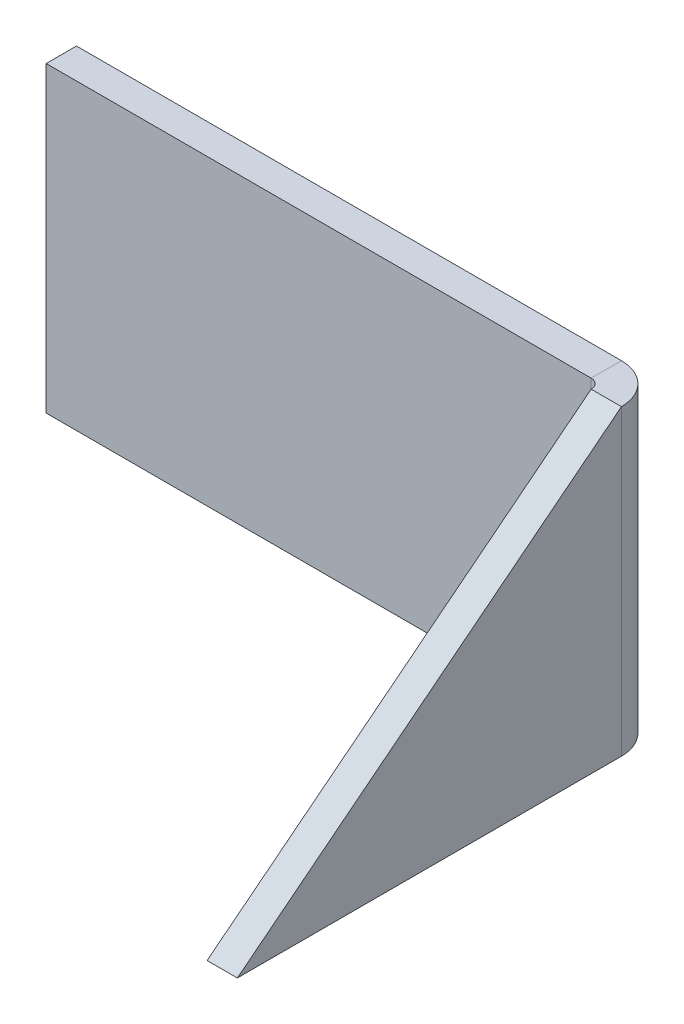
ISO-10303-21;
HEADER;
FILE_DESCRIPTION(('STEP AP214'),'2;1');
FILE_NAME('part.step','',(''),(''),'','','');
FILE_SCHEMA(('AUTOMOTIVE_DESIGN { 1 0 10303 214 1 1 1 1 }'));
ENDSEC;
DATA;
#1=APPLICATION_CONTEXT('core data for automotive mechanical design processes');
#2=APPLICATION_PROTOCOL_DEFINITION('international standard','automotive_design',2000,#1);
#3=PRODUCT_CONTEXT('',#1,'mechanical');
#4=PRODUCT('Part','Part','',(#3));
#5=PRODUCT_RELATED_PRODUCT_CATEGORY('part','',(#4));
#6=PRODUCT_DEFINITION_FORMATION('','',#4);
#7=PRODUCT_DEFINITION_CONTEXT('part definition',#1,'design');
#8=PRODUCT_DEFINITION('design','',#6,#7);
#9=PRODUCT_DEFINITION_SHAPE('','',#8);
#10=(LENGTH_UNIT() NAMED_UNIT(*) SI_UNIT(.MILLI.,.METRE.));
#11=(NAMED_UNIT(*) PLANE_ANGLE_UNIT() SI_UNIT($,.RADIAN.));
#12=(NAMED_UNIT(*) SI_UNIT($,.STERADIAN.) SOLID_ANGLE_UNIT());
#13=UNCERTAINTY_MEASURE_WITH_UNIT(LENGTH_MEASURE(1.E-05),#10,'distance_accuracy_value','');
#14=(GEOMETRIC_REPRESENTATION_CONTEXT(3) GLOBAL_UNCERTAINTY_ASSIGNED_CONTEXT((#13)) GLOBAL_UNIT_ASSIGNED_CONTEXT((#10,
#11,#12)) REPRESENTATION_CONTEXT('',''));
#15=CARTESIAN_POINT('',(0.,0.,0.));
#16=DIRECTION('',(0.,0.,1.));
#17=DIRECTION('',(1.,0.,0.));
#18=AXIS2_PLACEMENT_3D('',#15,#16,#17);
#19=CARTESIAN_POINT('',(-28.575,15.875,3.175));
#20=DIRECTION('',(0.,-1.,0.));
#21=DIRECTION('',(0.,0.,-1.));
#22=AXIS2_PLACEMENT_3D('',#19,#20,#21);
#23=PLANE('',#22);
#24=DIRECTION('',(-1.,0.,0.));
#25=VECTOR('',#24,1.);
#26=CARTESIAN_POINT('',(-28.575,15.875,0.));
#27=LINE('',#26,#25);
#28=CARTESIAN_POINT('',(28.575,15.875,0.));
#29=VERTEX_POINT('',#28);
#30=CARTESIAN_POINT('',(-28.575,15.875,0.));
#31=VERTEX_POINT('',#30);
#32=EDGE_CURVE('E175',#29,#31,#27,.T.);
#33=ORIENTED_EDGE('',*,*,#32,.T.);
#34=DIRECTION('',(0.,0.,-1.));
#35=VECTOR('',#34,1.);
#36=CARTESIAN_POINT('',(-28.575,15.875,3.175));
#37=LINE('',#36,#35);
#38=CARTESIAN_POINT('',(-28.575,15.875,3.175));
#39=VERTEX_POINT('',#38);
#40=EDGE_CURVE('E64',#39,#31,#37,.T.);
#41=ORIENTED_EDGE('',*,*,#40,.F.);
#42=DIRECTION('',(-1.,0.,0.));
#43=VECTOR('',#42,1.);
#44=CARTESIAN_POINT('',(-28.575,15.875,3.175));
#45=LINE('',#44,#43);
#46=CARTESIAN_POINT('',(28.575,15.875,3.175));
#47=VERTEX_POINT('',#46);
#48=EDGE_CURVE('E100',#47,#39,#45,.T.);
#49=ORIENTED_EDGE('',*,*,#48,.F.);
#50=DIRECTION('',(0.,0.,-1.));
#51=VECTOR('',#50,1.);
#52=CARTESIAN_POINT('',(28.575,15.875,3.175));
#53=LINE('',#52,#51);
#54=EDGE_CURVE('E13',#47,#29,#53,.T.);
#55=ORIENTED_EDGE('',*,*,#54,.T.);
#56=EDGE_LOOP('',(#33,#41,#49,#55));
#57=FACE_BOUND('',#56,.T.);
#58=ADVANCED_FACE('F56',(#57),#23,.F.);
#59=CARTESIAN_POINT('',(-28.575,15.875,3.175));
#60=DIRECTION('',(1.,0.,0.));
#61=DIRECTION('',(0.,1.,0.));
#62=AXIS2_PLACEMENT_3D('',#59,#60,#61);
#63=PLANE('',#62);
#64=DIRECTION('',(0.,-1.,0.));
#65=VECTOR('',#64,1.);
#66=CARTESIAN_POINT('',(-28.575,15.875,0.));
#67=LINE('',#66,#65);
#68=CARTESIAN_POINT('',(-28.575,-15.875,0.));
#69=VERTEX_POINT('',#68);
#70=EDGE_CURVE('E87',#31,#69,#67,.T.);
#71=ORIENTED_EDGE('',*,*,#70,.T.);
#72=DIRECTION('',(0.,0.,-1.));
#73=VECTOR('',#72,1.);
#74=CARTESIAN_POINT('',(-28.575,-15.875,3.175));
#75=LINE('',#74,#73);
#76=CARTESIAN_POINT('',(-28.575,-15.875,3.175));
#77=VERTEX_POINT('',#76);
#78=EDGE_CURVE('E182',#77,#69,#75,.T.);
#79=ORIENTED_EDGE('',*,*,#78,.F.);
#80=DIRECTION('',(0.,-1.,0.));
#81=VECTOR('',#80,1.);
#82=CARTESIAN_POINT('',(-28.575,15.875,3.175));
#83=LINE('',#82,#81);
#84=EDGE_CURVE('E168',#39,#77,#83,.T.);
#85=ORIENTED_EDGE('',*,*,#84,.F.);
#86=ORIENTED_EDGE('',*,*,#40,.T.);
#87=EDGE_LOOP('',(#71,#79,#85,#86));
#88=FACE_BOUND('',#87,.T.);
#89=ADVANCED_FACE('F184',(#88),#63,.F.);
#90=CARTESIAN_POINT('',(-28.575,-15.875,3.175));
#91=DIRECTION('',(0.,1.,0.));
#92=DIRECTION('',(0.,0.,1.));
#93=AXIS2_PLACEMENT_3D('',#90,#91,#92);
#94=PLANE('',#93);
#95=DIRECTION('',(1.,0.,0.));
#96=VECTOR('',#95,1.);
#97=CARTESIAN_POINT('',(-28.575,-15.875,0.));
#98=LINE('',#97,#96);
#99=CARTESIAN_POINT('',(28.575,-15.875,0.));
#100=VERTEX_POINT('',#99);
#101=EDGE_CURVE('E93',#69,#100,#98,.T.);
#102=ORIENTED_EDGE('',*,*,#101,.T.);
#103=DIRECTION('',(0.,0.,-1.));
#104=VECTOR('',#103,1.);
#105=CARTESIAN_POINT('',(28.575,-15.875,3.175));
#106=LINE('',#105,#104);
#107=CARTESIAN_POINT('',(28.575,-15.875,3.175));
#108=VERTEX_POINT('',#107);
#109=EDGE_CURVE('E171',#108,#100,#106,.T.);
#110=ORIENTED_EDGE('',*,*,#109,.F.);
#111=DIRECTION('',(1.,0.,0.));
#112=VECTOR('',#111,1.);
#113=CARTESIAN_POINT('',(-28.575,-15.875,3.175));
#114=LINE('',#113,#112);
#115=EDGE_CURVE('E72',#77,#108,#114,.T.);
#116=ORIENTED_EDGE('',*,*,#115,.F.);
#117=ORIENTED_EDGE('',*,*,#78,.T.);
#118=EDGE_LOOP('',(#102,#110,#116,#117));
#119=FACE_BOUND('',#118,.T.);
#120=ADVANCED_FACE('F221',(#119),#94,.F.);
#121=CARTESIAN_POINT('',(0.,0.,3.175));
#122=DIRECTION('',(0.,0.,1.));
#123=DIRECTION('',(1.,0.,0.));
#124=AXIS2_PLACEMENT_3D('',#121,#122,#123);
#125=PLANE('',#124);
#126=DIRECTION('',(0.,1.,0.));
#127=VECTOR('',#126,1.);
#128=CARTESIAN_POINT('',(28.575,15.875,3.175));
#129=LINE('',#128,#127);
#130=EDGE_CURVE('E165',#108,#47,#129,.T.);
#131=ORIENTED_EDGE('',*,*,#130,.T.);
#132=ORIENTED_EDGE('',*,*,#48,.T.);
#133=ORIENTED_EDGE('',*,*,#84,.T.);
#134=ORIENTED_EDGE('',*,*,#115,.T.);
#135=EDGE_LOOP('',(#131,#132,#133,#134));
#136=FACE_BOUND('',#135,.T.);
#137=ADVANCED_FACE('F225',(#136),#125,.T.);
#138=CARTESIAN_POINT('',(0.,0.,0.));
#139=DIRECTION('',(0.,0.,1.));
#140=DIRECTION('',(1.,0.,0.));
#141=AXIS2_PLACEMENT_3D('',#138,#139,#140);
#142=PLANE('',#141);
#143=DIRECTION('',(0.,1.,0.));
#144=VECTOR('',#143,1.);
#145=CARTESIAN_POINT('',(28.575,15.875,0.));
#146=LINE('',#145,#144);
#147=EDGE_CURVE('E172',#100,#29,#146,.T.);
#148=ORIENTED_EDGE('',*,*,#147,.F.);
#149=ORIENTED_EDGE('',*,*,#101,.F.);
#150=ORIENTED_EDGE('',*,*,#70,.F.);
#151=ORIENTED_EDGE('',*,*,#32,.F.);
#152=EDGE_LOOP('',(#148,#149,#150,#151));
#153=FACE_BOUND('',#152,.T.);
#154=ADVANCED_FACE('F187',(#153),#142,.F.);
#155=CARTESIAN_POINT('',(28.575,-15.875,4.175));
#156=DIRECTION('',(0.,-1.,0.));
#157=DIRECTION('',(0.,0.,-1.));
#158=AXIS2_PLACEMENT_3D('',#155,#156,#157);
#159=PLANE('',#158);
#160=DIRECTION('',(-1.,0.,0.));
#161=VECTOR('',#160,1.);
#162=CARTESIAN_POINT('',(32.75,-15.875,4.17499999999998));
#163=LINE('',#162,#161);
#164=CARTESIAN_POINT('',(29.575,-15.875,4.17499999999999));
#165=VERTEX_POINT('',#164);
#166=CARTESIAN_POINT('',(32.75,-15.875,4.17499999999998));
#167=VERTEX_POINT('',#166);
#168=EDGE_CURVE('E144',#165,#167,#163,.F.);
#169=ORIENTED_EDGE('',*,*,#168,.F.);
#170=CARTESIAN_POINT('',(28.575,-15.875,4.175));
#171=DIRECTION('',(0.,1.,0.));
#172=DIRECTION('',(0.,0.,1.));
#173=AXIS2_PLACEMENT_3D('',#170,#171,#172);
#174=CIRCLE('',#173,1.);
#175=EDGE_CURVE('E153',#108,#165,#174,.F.);
#176=ORIENTED_EDGE('',*,*,#175,.F.);
#177=ORIENTED_EDGE('',*,*,#109,.T.);
#178=CARTESIAN_POINT('',(28.575,-15.875,4.175));
#179=DIRECTION('',(0.,1.,0.));
#180=DIRECTION('',(0.,0.,1.));
#181=AXIS2_PLACEMENT_3D('',#178,#179,#180);
#182=CIRCLE('',#181,4.175);
#183=EDGE_CURVE('E176',#100,#167,#182,.F.);
#184=ORIENTED_EDGE('',*,*,#183,.T.);
#185=EDGE_LOOP('',(#169,#176,#177,#184));
#186=FACE_BOUND('',#185,.T.);
#187=ADVANCED_FACE('F192',(#186),#159,.T.);
#188=CARTESIAN_POINT('',(28.575,15.875,4.175));
#189=DIRECTION('',(0.,-1.,0.));
#190=DIRECTION('',(0.,0.,-1.));
#191=AXIS2_PLACEMENT_3D('',#188,#189,#190);
#192=PLANE('',#191);
#193=CARTESIAN_POINT('',(28.575,15.875,4.175));
#194=DIRECTION('',(0.,1.,0.));
#195=DIRECTION('',(0.,0.,1.));
#196=AXIS2_PLACEMENT_3D('',#193,#194,#195);
#197=CIRCLE('',#196,1.);
#198=CARTESIAN_POINT('',(29.575,15.875,4.17499999999999));
#199=VERTEX_POINT('',#198);
#200=EDGE_CURVE('E151',#199,#47,#197,.T.);
#201=ORIENTED_EDGE('',*,*,#200,.F.);
#202=DIRECTION('',(-1.,0.,0.));
#203=VECTOR('',#202,1.);
#204=CARTESIAN_POINT('',(29.575,15.875,4.17499999999999));
#205=LINE('',#204,#203);
#206=CARTESIAN_POINT('',(32.75,15.875,4.17499999999998));
#207=VERTEX_POINT('',#206);
#208=EDGE_CURVE('E122',#199,#207,#205,.F.);
#209=ORIENTED_EDGE('',*,*,#208,.T.);
#210=CARTESIAN_POINT('',(28.575,15.875,4.175));
#211=DIRECTION('',(0.,1.,0.));
#212=DIRECTION('',(0.,0.,1.));
#213=AXIS2_PLACEMENT_3D('',#210,#211,#212);
#214=CIRCLE('',#213,4.175);
#215=EDGE_CURVE('E159',#207,#29,#214,.T.);
#216=ORIENTED_EDGE('',*,*,#215,.T.);
#217=ORIENTED_EDGE('',*,*,#54,.F.);
#218=EDGE_LOOP('',(#201,#209,#216,#217));
#219=FACE_BOUND('',#218,.T.);
#220=ADVANCED_FACE('F156',(#219),#192,.F.);
#221=CARTESIAN_POINT('',(28.575,15.875,4.175));
#222=DIRECTION('',(0.,1.,0.));
#223=DIRECTION('',(1.,0.,0.));
#224=AXIS2_PLACEMENT_3D('',#221,#222,#223);
#225=CYLINDRICAL_SURFACE('',#224,4.175);
#226=ORIENTED_EDGE('',*,*,#147,.T.);
#227=ORIENTED_EDGE('',*,*,#215,.F.);
#228=DIRECTION('',(0.,1.,0.));
#229=VECTOR('',#228,1.);
#230=CARTESIAN_POINT('',(32.75,-15.875,4.17499999999998));
#231=LINE('',#230,#229);
#232=EDGE_CURVE('E134',#207,#167,#231,.F.);
#233=ORIENTED_EDGE('',*,*,#232,.T.);
#234=ORIENTED_EDGE('',*,*,#183,.F.);
#235=EDGE_LOOP('',(#226,#227,#233,#234));
#236=FACE_BOUND('',#235,.T.);
#237=ADVANCED_FACE('F194',(#236),#225,.T.);
#238=CARTESIAN_POINT('',(28.575,15.875,4.175));
#239=DIRECTION('',(0.,1.,0.));
#240=DIRECTION('',(1.,0.,0.));
#241=AXIS2_PLACEMENT_3D('',#238,#239,#240);
#242=CYLINDRICAL_SURFACE('',#241,1.);
#243=ORIENTED_EDGE('',*,*,#130,.F.);
#244=ORIENTED_EDGE('',*,*,#175,.T.);
#245=DIRECTION('',(0.,1.,0.));
#246=VECTOR('',#245,1.);
#247=CARTESIAN_POINT('',(29.575,-15.875,4.17499999999999));
#248=LINE('',#247,#246);
#249=EDGE_CURVE('E135',#165,#199,#248,.T.);
#250=ORIENTED_EDGE('',*,*,#249,.T.);
#251=ORIENTED_EDGE('',*,*,#200,.T.);
#252=EDGE_LOOP('',(#243,#244,#250,#251));
#253=FACE_BOUND('',#252,.T.);
#254=ADVANCED_FACE('F150',(#253),#242,.F.);
#255=CARTESIAN_POINT('',(32.75,-15.875,3.17499999999999));
#256=DIRECTION('',(0.,1.,0.));
#257=DIRECTION('',(0.,0.,1.));
#258=AXIS2_PLACEMENT_3D('',#255,#256,#257);
#259=PLANE('',#258);
#260=ORIENTED_EDGE('',*,*,#168,.T.);
#261=DIRECTION('',(0.,0.,-1.));
#262=VECTOR('',#261,1.);
#263=CARTESIAN_POINT('',(32.75,-15.875,-1.07963087370762E-13));
#264=LINE('',#263,#262);
#265=CARTESIAN_POINT('',(32.7500000000001,-15.875,44.45));
#266=VERTEX_POINT('',#265);
#267=EDGE_CURVE('E161',#266,#167,#264,.T.);
#268=ORIENTED_EDGE('',*,*,#267,.F.);
#269=DIRECTION('',(-1.,0.,0.));
#270=VECTOR('',#269,1.);
#271=CARTESIAN_POINT('',(32.7500000000001,-15.875,44.45));
#272=LINE('',#271,#270);
#273=CARTESIAN_POINT('',(29.5750000000001,-15.875,44.45));
#274=VERTEX_POINT('',#273);
#275=EDGE_CURVE('E157',#266,#274,#272,.T.);
#276=ORIENTED_EDGE('',*,*,#275,.T.);
#277=DIRECTION('',(0.,0.,1.));
#278=VECTOR('',#277,1.);
#279=CARTESIAN_POINT('',(29.575,-15.875,3.175));
#280=LINE('',#279,#278);
#281=EDGE_CURVE('E143',#274,#165,#280,.F.);
#282=ORIENTED_EDGE('',*,*,#281,.T.);
#283=EDGE_LOOP('',(#260,#268,#276,#282));
#284=FACE_BOUND('',#283,.T.);
#285=ADVANCED_FACE('F206',(#284),#259,.F.);
#286=CARTESIAN_POINT('',(32.75,0.,-1.11966295392247E-13));
#287=DIRECTION('',(-1.,0.,0.));
#288=DIRECTION('',(0.,0.,1.));
#289=AXIS2_PLACEMENT_3D('',#286,#287,#288);
#290=PLANE('',#289);
#291=ORIENTED_EDGE('',*,*,#232,.F.);
#292=DIRECTION('',(0.,0.619090944115098,-0.785319299975925));
#293=VECTOR('',#292,1.);
#294=CARTESIAN_POINT('',(32.75,15.875,4.17499999999998));
#295=LINE('',#294,#293);
#296=EDGE_CURVE('E128',#266,#207,#295,.T.);
#297=ORIENTED_EDGE('',*,*,#296,.F.);
#298=ORIENTED_EDGE('',*,*,#267,.T.);
#299=EDGE_LOOP('',(#291,#297,#298));
#300=FACE_BOUND('',#299,.T.);
#301=ADVANCED_FACE('F204',(#300),#290,.F.);
#302=CARTESIAN_POINT('',(29.575,0.,-1.0088084214142E-13));
#303=DIRECTION('',(-1.,0.,0.));
#304=DIRECTION('',(0.,0.,1.));
#305=AXIS2_PLACEMENT_3D('',#302,#303,#304);
#306=PLANE('',#305);
#307=DIRECTION('',(0.,0.619090944115098,-0.785319299975925));
#308=VECTOR('',#307,1.);
#309=CARTESIAN_POINT('',(29.575,15.875,4.17499999999999));
#310=LINE('',#309,#308);
#311=EDGE_CURVE('E125',#274,#199,#310,.T.);
#312=ORIENTED_EDGE('',*,*,#311,.T.);
#313=ORIENTED_EDGE('',*,*,#249,.F.);
#314=ORIENTED_EDGE('',*,*,#281,.F.);
#315=EDGE_LOOP('',(#312,#313,#314));
#316=FACE_BOUND('',#315,.T.);
#317=ADVANCED_FACE('F141',(#316),#306,.T.);
#318=CARTESIAN_POINT('',(29.575,15.875,4.17499999999999));
#319=DIRECTION('',(0.,-0.785319299975924,-0.619090944115098));
#320=DIRECTION('',(0.,0.619090944115098,-0.785319299975925));
#321=AXIS2_PLACEMENT_3D('',#318,#319,#320);
#322=PLANE('',#321);
#323=ORIENTED_EDGE('',*,*,#296,.T.);
#324=ORIENTED_EDGE('',*,*,#208,.F.);
#325=ORIENTED_EDGE('',*,*,#311,.F.);
#326=ORIENTED_EDGE('',*,*,#275,.F.);
#327=EDGE_LOOP('',(#323,#324,#325,#326));
#328=FACE_BOUND('',#327,.T.);
#329=ADVANCED_FACE('F124',(#328),#322,.F.);
#330=CLOSED_SHELL('',(#58,#89,#120,#137,#154,#187,#220,#237,#254,#285,#301,#317,#329));
#331=MANIFOLD_SOLID_BREP('B2',#330);
#332=ADVANCED_BREP_SHAPE_REPRESENTATION('',(#18,#331),#14);
#333=SHAPE_DEFINITION_REPRESENTATION(#9,#332);
ENDSEC;
END-ISO-10303-21;
